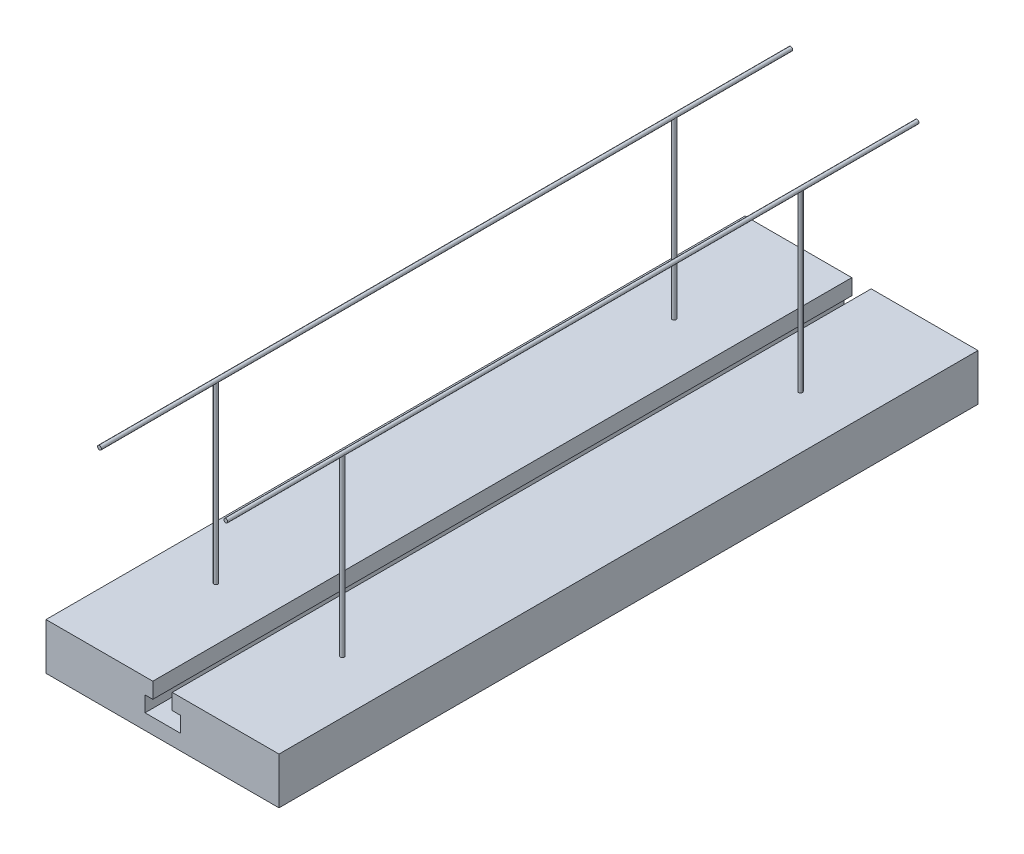
ISO-10303-21;
HEADER;
FILE_DESCRIPTION(('STEP AP214'),'2;1');
FILE_NAME('part.step','',(''),(''),'','','');
FILE_SCHEMA(('AUTOMOTIVE_DESIGN { 1 0 10303 214 1 1 1 1 }'));
ENDSEC;
DATA;
#1=APPLICATION_CONTEXT('core data for automotive mechanical design processes');
#2=APPLICATION_PROTOCOL_DEFINITION('international standard','automotive_design',2000,#1);
#3=PRODUCT_CONTEXT('',#1,'mechanical');
#4=PRODUCT('Part','Part','',(#3));
#5=PRODUCT_RELATED_PRODUCT_CATEGORY('part','',(#4));
#6=PRODUCT_DEFINITION_FORMATION('','',#4);
#7=PRODUCT_DEFINITION_CONTEXT('part definition',#1,'design');
#8=PRODUCT_DEFINITION('design','',#6,#7);
#9=PRODUCT_DEFINITION_SHAPE('','',#8);
#10=(LENGTH_UNIT() NAMED_UNIT(*) SI_UNIT(.MILLI.,.METRE.));
#11=(NAMED_UNIT(*) PLANE_ANGLE_UNIT() SI_UNIT($,.RADIAN.));
#12=(NAMED_UNIT(*) SI_UNIT($,.STERADIAN.) SOLID_ANGLE_UNIT());
#13=UNCERTAINTY_MEASURE_WITH_UNIT(LENGTH_MEASURE(1.E-05),#10,'distance_accuracy_value','');
#14=(GEOMETRIC_REPRESENTATION_CONTEXT(3) GLOBAL_UNCERTAINTY_ASSIGNED_CONTEXT((#13)) GLOBAL_UNIT_ASSIGNED_CONTEXT((#10,
#11,#12)) REPRESENTATION_CONTEXT('',''));
#15=CARTESIAN_POINT('',(0.,0.,0.));
#16=DIRECTION('',(0.,0.,1.));
#17=DIRECTION('',(1.,0.,0.));
#18=AXIS2_PLACEMENT_3D('',#15,#16,#17);
#19=CARTESIAN_POINT('',(255.136171472381,37.5771918985887,2700.));
#20=DIRECTION('',(0.,1.,0.));
#21=DIRECTION('',(0.,0.,1.));
#22=AXIS2_PLACEMENT_3D('',#19,#20,#21);
#23=PLANE('',#22);
#24=DIRECTION('',(1.,0.,0.));
#25=VECTOR('',#24,1.);
#26=CARTESIAN_POINT('',(255.136171472381,37.5771918985887,900.000000000005));
#27=LINE('',#26,#25);
#28=CARTESIAN_POINT('',(40.1509964356934,37.5771918985887,900.000000000005));
#29=VERTEX_POINT('',#28);
#30=CARTESIAN_POINT('',(315.159081533357,37.5771918985887,900.000000000005));
#31=VERTEX_POINT('',#30);
#32=EDGE_CURVE('P0_E133',#29,#31,#27,.T.);
#33=ORIENTED_EDGE('',*,*,#32,.F.);
#34=DIRECTION('',(0.,0.,-1.));
#35=VECTOR('',#34,1.);
#36=CARTESIAN_POINT('',(40.1509964356934,37.5771918985887,2700.));
#37=LINE('',#36,#35);
#38=CARTESIAN_POINT('',(40.1509964356934,37.5771918985887,2700.));
#39=VERTEX_POINT('',#38);
#40=EDGE_CURVE('P0_E22',#39,#29,#37,.T.);
#41=ORIENTED_EDGE('',*,*,#40,.F.);
#42=DIRECTION('',(1.,0.,0.));
#43=VECTOR('',#42,1.);
#44=CARTESIAN_POINT('',(255.136171472381,37.5771918985887,2700.));
#45=LINE('',#44,#43);
#46=CARTESIAN_POINT('',(315.159081533357,37.5771918985887,2700.));
#47=VERTEX_POINT('',#46);
#48=EDGE_CURVE('P0_E159',#39,#47,#45,.T.);
#49=ORIENTED_EDGE('',*,*,#48,.T.);
#50=DIRECTION('',(0.,0.,-1.));
#51=VECTOR('',#50,1.);
#52=CARTESIAN_POINT('',(315.159081533357,37.5771918985887,2700.));
#53=LINE('',#52,#51);
#54=EDGE_CURVE('P0_E37',#47,#31,#53,.T.);
#55=ORIENTED_EDGE('',*,*,#54,.T.);
#56=EDGE_LOOP('',(#33,#41,#49,#55));
#57=FACE_BOUND('',#56,.T.);
#58=ADVANCED_FACE('P0_F15',(#57),#23,.T.);
#59=CARTESIAN_POINT('',(40.1509964356934,222.904551654686,2700.));
#60=DIRECTION('',(1.,0.,0.));
#61=DIRECTION('',(0.,0.,-1.));
#62=AXIS2_PLACEMENT_3D('',#59,#60,#61);
#63=PLANE('',#62);
#64=DIRECTION('',(0.,-1.,0.));
#65=VECTOR('',#64,1.);
#66=CARTESIAN_POINT('',(40.1509964356934,222.904551654686,900.000000000005));
#67=LINE('',#66,#65);
#68=CARTESIAN_POINT('',(40.1509964356934,-2.92836654211198,900.000000000005));
#69=VERTEX_POINT('',#68);
#70=EDGE_CURVE('P0_E135',#29,#69,#67,.T.);
#71=ORIENTED_EDGE('',*,*,#70,.T.);
#72=DIRECTION('',(0.,0.,-1.));
#73=VECTOR('',#72,1.);
#74=CARTESIAN_POINT('',(40.1509964356934,-2.92836654211198,2700.));
#75=LINE('',#74,#73);
#76=CARTESIAN_POINT('',(40.1509964356934,-2.92836654211198,2700.));
#77=VERTEX_POINT('',#76);
#78=EDGE_CURVE('P0_E171',#77,#69,#75,.T.);
#79=ORIENTED_EDGE('',*,*,#78,.F.);
#80=DIRECTION('',(0.,-1.,0.));
#81=VECTOR('',#80,1.);
#82=CARTESIAN_POINT('',(40.1509964356934,222.904551654686,2700.));
#83=LINE('',#82,#81);
#84=EDGE_CURVE('P0_E177',#39,#77,#83,.T.);
#85=ORIENTED_EDGE('',*,*,#84,.F.);
#86=ORIENTED_EDGE('',*,*,#40,.T.);
#87=EDGE_LOOP('',(#71,#79,#85,#86));
#88=FACE_BOUND('',#87,.T.);
#89=ADVANCED_FACE('P0_F175',(#88),#63,.F.);
#90=CARTESIAN_POINT('',(255.136171472381,-2.92836654211198,2700.));
#91=DIRECTION('',(0.,1.,0.));
#92=DIRECTION('',(0.,0.,1.));
#93=AXIS2_PLACEMENT_3D('',#90,#91,#92);
#94=PLANE('',#93);
#95=DIRECTION('',(1.,0.,0.));
#96=VECTOR('',#95,1.);
#97=CARTESIAN_POINT('',(255.136171472381,-2.92836654211198,900.000000000005));
#98=LINE('',#97,#96);
#99=CARTESIAN_POINT('',(61.6673890539489,-2.92836654211198,900.000000000002));
#100=VERTEX_POINT('',#99);
#101=EDGE_CURVE('P0_E138',#69,#100,#98,.T.);
#102=ORIENTED_EDGE('',*,*,#101,.T.);
#103=DIRECTION('',(0.,0.,1.));
#104=VECTOR('',#103,1.);
#105=CARTESIAN_POINT('',(61.6673890539489,-2.92836654211198,-48290.));
#106=LINE('',#105,#104);
#107=CARTESIAN_POINT('',(61.6673890539489,-2.92836654211198,2700.00000000001));
#108=VERTEX_POINT('',#107);
#109=EDGE_CURVE('P0_E236',#100,#108,#106,.T.);
#110=ORIENTED_EDGE('',*,*,#109,.T.);
#111=DIRECTION('',(1.,0.,0.));
#112=VECTOR('',#111,1.);
#113=CARTESIAN_POINT('',(255.136171472381,-2.92836654211198,2700.));
#114=LINE('',#113,#112);
#115=EDGE_CURVE('P0_E241',#77,#108,#114,.T.);
#116=ORIENTED_EDGE('',*,*,#115,.F.);
#117=ORIENTED_EDGE('',*,*,#78,.T.);
#118=EDGE_LOOP('',(#102,#110,#116,#117));
#119=FACE_BOUND('',#118,.T.);
#120=ADVANCED_FACE('P0_F186',(#119),#94,.F.);
#121=CARTESIAN_POINT('',(255.136171472381,-42.9283665421119,2700.));
#122=DIRECTION('',(0.,-1.,0.));
#123=DIRECTION('',(1.,0.,0.));
#124=AXIS2_PLACEMENT_3D('',#121,#122,#123);
#125=PLANE('',#124);
#126=DIRECTION('',(-1.,0.,0.));
#127=VECTOR('',#126,1.);
#128=CARTESIAN_POINT('',(255.136171472381,-42.9283665421119,900.000000000005));
#129=LINE('',#128,#127);
#130=CARTESIAN_POINT('',(61.6673890539489,-42.928366542112,900.000000000005));
#131=VERTEX_POINT('',#130);
#132=CARTESIAN_POINT('',(-29.8490035643066,-42.928366542112,900.000000000005));
#133=VERTEX_POINT('',#132);
#134=EDGE_CURVE('P0_E28',#131,#133,#129,.T.);
#135=ORIENTED_EDGE('',*,*,#134,.T.);
#136=DIRECTION('',(0.,0.,-1.));
#137=VECTOR('',#136,1.);
#138=CARTESIAN_POINT('',(-29.8490035643066,-42.928366542112,2700.));
#139=LINE('',#138,#137);
#140=CARTESIAN_POINT('',(-29.8490035643066,-42.928366542112,2700.));
#141=VERTEX_POINT('',#140);
#142=EDGE_CURVE('P0_E169',#141,#133,#139,.T.);
#143=ORIENTED_EDGE('',*,*,#142,.F.);
#144=DIRECTION('',(-1.,0.,0.));
#145=VECTOR('',#144,1.);
#146=CARTESIAN_POINT('',(255.136171472381,-42.9283665421119,2700.));
#147=LINE('',#146,#145);
#148=CARTESIAN_POINT('',(61.6673890539489,-42.928366542112,2700.00000000001));
#149=VERTEX_POINT('',#148);
#150=EDGE_CURVE('P0_E248',#149,#141,#147,.T.);
#151=ORIENTED_EDGE('',*,*,#150,.F.);
#152=DIRECTION('',(0.,0.,1.));
#153=VECTOR('',#152,1.);
#154=CARTESIAN_POINT('',(61.6673890539489,-42.928366542112,-48290.));
#155=LINE('',#154,#153);
#156=EDGE_CURVE('P0_E238',#131,#149,#155,.T.);
#157=ORIENTED_EDGE('',*,*,#156,.F.);
#158=EDGE_LOOP('',(#135,#143,#151,#157));
#159=FACE_BOUND('',#158,.T.);
#160=ADVANCED_FACE('P0_F190',(#159),#125,.F.);
#161=CARTESIAN_POINT('',(-29.8490035643069,222.904551654686,2700.));
#162=DIRECTION('',(1.,0.,0.));
#163=DIRECTION('',(0.,1.,0.));
#164=AXIS2_PLACEMENT_3D('',#161,#162,#163);
#165=PLANE('',#164);
#166=DIRECTION('',(0.,-1.,0.));
#167=VECTOR('',#166,1.);
#168=CARTESIAN_POINT('',(-29.8490035643069,222.904551654686,900.000000000005));
#169=LINE('',#168,#167);
#170=CARTESIAN_POINT('',(-29.8490035643066,-2.92836654211204,900.000000000005));
#171=VERTEX_POINT('',#170);
#172=EDGE_CURVE('P0_E142',#171,#133,#169,.T.);
#173=ORIENTED_EDGE('',*,*,#172,.F.);
#174=DIRECTION('',(0.,0.,-1.));
#175=VECTOR('',#174,1.);
#176=CARTESIAN_POINT('',(-29.8490035643066,-2.92836654211204,2700.));
#177=LINE('',#176,#175);
#178=CARTESIAN_POINT('',(-29.8490035643066,-2.92836654211204,2700.));
#179=VERTEX_POINT('',#178);
#180=EDGE_CURVE('P0_E167',#179,#171,#177,.T.);
#181=ORIENTED_EDGE('',*,*,#180,.F.);
#182=DIRECTION('',(0.,-1.,0.));
#183=VECTOR('',#182,1.);
#184=CARTESIAN_POINT('',(-29.8490035643069,222.904551654686,2700.));
#185=LINE('',#184,#183);
#186=EDGE_CURVE('P0_E250',#179,#141,#185,.T.);
#187=ORIENTED_EDGE('',*,*,#186,.T.);
#188=ORIENTED_EDGE('',*,*,#142,.T.);
#189=EDGE_LOOP('',(#173,#181,#187,#188));
#190=FACE_BOUND('',#189,.T.);
#191=ADVANCED_FACE('P0_F196',(#190),#165,.T.);
#192=CARTESIAN_POINT('',(255.136171472381,-2.92836654211204,2700.));
#193=DIRECTION('',(0.,-1.,0.));
#194=DIRECTION('',(0.,0.,-1.));
#195=AXIS2_PLACEMENT_3D('',#192,#193,#194);
#196=PLANE('',#195);
#197=DIRECTION('',(-1.,0.,0.));
#198=VECTOR('',#197,1.);
#199=CARTESIAN_POINT('',(255.136171472381,-2.92836654211204,900.000000000005));
#200=LINE('',#199,#198);
#201=CARTESIAN_POINT('',(-9.84900356430662,-2.92836654211204,900.000000000005));
#202=VERTEX_POINT('',#201);
#203=EDGE_CURVE('P0_E144',#202,#171,#200,.T.);
#204=ORIENTED_EDGE('',*,*,#203,.F.);
#205=DIRECTION('',(0.,0.,-1.));
#206=VECTOR('',#205,1.);
#207=CARTESIAN_POINT('',(-9.84900356430662,-2.92836654211204,2700.));
#208=LINE('',#207,#206);
#209=CARTESIAN_POINT('',(-9.84900356430662,-2.92836654211204,2700.));
#210=VERTEX_POINT('',#209);
#211=EDGE_CURVE('P0_E165',#210,#202,#208,.T.);
#212=ORIENTED_EDGE('',*,*,#211,.F.);
#213=DIRECTION('',(-1.,0.,0.));
#214=VECTOR('',#213,1.);
#215=CARTESIAN_POINT('',(255.136171472381,-2.92836654211204,2700.));
#216=LINE('',#215,#214);
#217=EDGE_CURVE('P0_E253',#210,#179,#216,.T.);
#218=ORIENTED_EDGE('',*,*,#217,.T.);
#219=ORIENTED_EDGE('',*,*,#180,.T.);
#220=EDGE_LOOP('',(#204,#212,#218,#219));
#221=FACE_BOUND('',#220,.T.);
#222=ADVANCED_FACE('P0_F200',(#221),#196,.T.);
#223=CARTESIAN_POINT('',(-9.84900356430662,222.904551654686,2700.));
#224=DIRECTION('',(1.,0.,0.));
#225=DIRECTION('',(0.,0.,-1.));
#226=AXIS2_PLACEMENT_3D('',#223,#224,#225);
#227=PLANE('',#226);
#228=DIRECTION('',(0.,-1.,0.));
#229=VECTOR('',#228,1.);
#230=CARTESIAN_POINT('',(-9.84900356430662,222.904551654686,900.000000000005));
#231=LINE('',#230,#229);
#232=CARTESIAN_POINT('',(-9.84900356430662,37.5771918985887,900.000000000005));
#233=VERTEX_POINT('',#232);
#234=EDGE_CURVE('P0_E147',#233,#202,#231,.T.);
#235=ORIENTED_EDGE('',*,*,#234,.F.);
#236=DIRECTION('',(0.,0.,-1.));
#237=VECTOR('',#236,1.);
#238=CARTESIAN_POINT('',(-9.84900356430662,37.5771918985887,2700.));
#239=LINE('',#238,#237);
#240=CARTESIAN_POINT('',(-9.84900356430662,37.5771918985887,2700.));
#241=VERTEX_POINT('',#240);
#242=EDGE_CURVE('P0_E163',#241,#233,#239,.T.);
#243=ORIENTED_EDGE('',*,*,#242,.F.);
#244=DIRECTION('',(0.,-1.,0.));
#245=VECTOR('',#244,1.);
#246=CARTESIAN_POINT('',(-9.84900356430662,222.904551654686,2700.));
#247=LINE('',#246,#245);
#248=EDGE_CURVE('P0_E256',#241,#210,#247,.T.);
#249=ORIENTED_EDGE('',*,*,#248,.T.);
#250=ORIENTED_EDGE('',*,*,#211,.T.);
#251=EDGE_LOOP('',(#235,#243,#249,#250));
#252=FACE_BOUND('',#251,.T.);
#253=ADVANCED_FACE('P0_F204',(#252),#227,.T.);
#254=CARTESIAN_POINT('',(255.136171472381,37.5771918985887,2700.));
#255=DIRECTION('',(0.,1.,0.));
#256=DIRECTION('',(0.,0.,1.));
#257=AXIS2_PLACEMENT_3D('',#254,#255,#256);
#258=PLANE('',#257);
#259=DIRECTION('',(1.,0.,0.));
#260=VECTOR('',#259,1.);
#261=CARTESIAN_POINT('',(255.136171472381,37.5771918985887,900.000000000005));
#262=LINE('',#261,#260);
#263=CARTESIAN_POINT('',(-284.840918466643,37.5771918985887,900.000000000005));
#264=VERTEX_POINT('',#263);
#265=EDGE_CURVE('P0_E150',#264,#233,#262,.T.);
#266=ORIENTED_EDGE('',*,*,#265,.F.);
#267=DIRECTION('',(0.,0.,-1.));
#268=VECTOR('',#267,1.);
#269=CARTESIAN_POINT('',(-284.840918466643,37.5771918985887,2700.));
#270=LINE('',#269,#268);
#271=CARTESIAN_POINT('',(-284.840918466643,37.5771918985887,2700.));
#272=VERTEX_POINT('',#271);
#273=EDGE_CURVE('P0_E124',#272,#264,#270,.T.);
#274=ORIENTED_EDGE('',*,*,#273,.F.);
#275=DIRECTION('',(1.,0.,0.));
#276=VECTOR('',#275,1.);
#277=CARTESIAN_POINT('',(255.136171472381,37.5771918985887,2700.));
#278=LINE('',#277,#276);
#279=EDGE_CURVE('P0_E113',#272,#241,#278,.T.);
#280=ORIENTED_EDGE('',*,*,#279,.T.);
#281=ORIENTED_EDGE('',*,*,#242,.T.);
#282=EDGE_LOOP('',(#266,#274,#280,#281));
#283=FACE_BOUND('',#282,.T.);
#284=ADVANCED_FACE('P0_F208',(#283),#258,.T.);
#285=CARTESIAN_POINT('',(-284.840918466643,222.904551654686,2700.));
#286=DIRECTION('',(1.,0.,0.));
#287=DIRECTION('',(0.,1.,0.));
#288=AXIS2_PLACEMENT_3D('',#285,#286,#287);
#289=PLANE('',#288);
#290=DIRECTION('',(0.,-1.,0.));
#291=VECTOR('',#290,1.);
#292=CARTESIAN_POINT('',(-284.840918466643,222.904551654686,900.000000000005));
#293=LINE('',#292,#291);
#294=CARTESIAN_POINT('',(-284.840918466643,-82.4228081014112,900.000000000005));
#295=VERTEX_POINT('',#294);
#296=EDGE_CURVE('P0_E120',#264,#295,#293,.T.);
#297=ORIENTED_EDGE('',*,*,#296,.T.);
#298=DIRECTION('',(0.,0.,-1.));
#299=VECTOR('',#298,1.);
#300=CARTESIAN_POINT('',(-284.840918466643,-82.4228081014112,2700.));
#301=LINE('',#300,#299);
#302=CARTESIAN_POINT('',(-284.840918466643,-82.4228081014112,2700.));
#303=VERTEX_POINT('',#302);
#304=EDGE_CURVE('P0_E117',#303,#295,#301,.T.);
#305=ORIENTED_EDGE('',*,*,#304,.F.);
#306=DIRECTION('',(0.,-1.,0.));
#307=VECTOR('',#306,1.);
#308=CARTESIAN_POINT('',(-284.840918466643,222.904551654686,2700.));
#309=LINE('',#308,#307);
#310=EDGE_CURVE('P0_E103',#272,#303,#309,.T.);
#311=ORIENTED_EDGE('',*,*,#310,.F.);
#312=ORIENTED_EDGE('',*,*,#273,.T.);
#313=EDGE_LOOP('',(#297,#305,#311,#312));
#314=FACE_BOUND('',#313,.T.);
#315=ADVANCED_FACE('P0_F118',(#314),#289,.F.);
#316=CARTESIAN_POINT('',(255.136171472381,-82.4228081014112,2700.));
#317=DIRECTION('',(0.,1.,0.));
#318=DIRECTION('',(0.,0.,1.));
#319=AXIS2_PLACEMENT_3D('',#316,#317,#318);
#320=PLANE('',#319);
#321=DIRECTION('',(1.,0.,0.));
#322=VECTOR('',#321,1.);
#323=CARTESIAN_POINT('',(255.136171472381,-82.4228081014112,900.000000000005));
#324=LINE('',#323,#322);
#325=CARTESIAN_POINT('',(315.159081533357,-82.4228081014112,900.000000000005));
#326=VERTEX_POINT('',#325);
#327=EDGE_CURVE('P0_E154',#295,#326,#324,.T.);
#328=ORIENTED_EDGE('',*,*,#327,.T.);
#329=DIRECTION('',(0.,0.,-1.));
#330=VECTOR('',#329,1.);
#331=CARTESIAN_POINT('',(315.159081533357,-82.4228081014112,2700.));
#332=LINE('',#331,#330);
#333=CARTESIAN_POINT('',(315.159081533357,-82.4228081014112,2700.));
#334=VERTEX_POINT('',#333);
#335=EDGE_CURVE('P0_E125',#334,#326,#332,.T.);
#336=ORIENTED_EDGE('',*,*,#335,.F.);
#337=DIRECTION('',(1.,0.,0.));
#338=VECTOR('',#337,1.);
#339=CARTESIAN_POINT('',(255.136171472381,-82.4228081014112,2700.));
#340=LINE('',#339,#338);
#341=EDGE_CURVE('P0_E109',#303,#334,#340,.T.);
#342=ORIENTED_EDGE('',*,*,#341,.F.);
#343=ORIENTED_EDGE('',*,*,#304,.T.);
#344=EDGE_LOOP('',(#328,#336,#342,#343));
#345=FACE_BOUND('',#344,.T.);
#346=ADVANCED_FACE('P0_F127',(#345),#320,.F.);
#347=CARTESIAN_POINT('',(315.159081533357,222.904551654686,2700.));
#348=DIRECTION('',(1.,0.,0.));
#349=DIRECTION('',(0.,0.,-1.));
#350=AXIS2_PLACEMENT_3D('',#347,#348,#349);
#351=PLANE('',#350);
#352=DIRECTION('',(0.,-1.,0.));
#353=VECTOR('',#352,1.);
#354=CARTESIAN_POINT('',(315.159081533357,222.904551654686,900.000000000005));
#355=LINE('',#354,#353);
#356=EDGE_CURVE('P0_E156',#31,#326,#355,.T.);
#357=ORIENTED_EDGE('',*,*,#356,.F.);
#358=ORIENTED_EDGE('',*,*,#54,.F.);
#359=DIRECTION('',(0.,-1.,0.));
#360=VECTOR('',#359,1.);
#361=CARTESIAN_POINT('',(315.159081533357,222.904551654686,2700.));
#362=LINE('',#361,#360);
#363=EDGE_CURVE('P0_E128',#47,#334,#362,.T.);
#364=ORIENTED_EDGE('',*,*,#363,.T.);
#365=ORIENTED_EDGE('',*,*,#335,.T.);
#366=EDGE_LOOP('',(#357,#358,#364,#365));
#367=FACE_BOUND('',#366,.T.);
#368=ADVANCED_FACE('P0_F217',(#367),#351,.T.);
#369=CARTESIAN_POINT('',(255.136171472381,222.904551654686,2700.));
#370=DIRECTION('',(0.,0.,1.));
#371=DIRECTION('',(1.,0.,0.));
#372=AXIS2_PLACEMENT_3D('',#369,#370,#371);
#373=PLANE('',#372);
#374=ORIENTED_EDGE('',*,*,#115,.T.);
#375=DIRECTION('',(0.,1.,0.));
#376=VECTOR('',#375,1.);
#377=CARTESIAN_POINT('',(61.6673890539489,222.904551654686,2700.));
#378=LINE('',#377,#376);
#379=EDGE_CURVE('P0_E136',#149,#108,#378,.T.);
#380=ORIENTED_EDGE('',*,*,#379,.F.);
#381=ORIENTED_EDGE('',*,*,#150,.T.);
#382=ORIENTED_EDGE('',*,*,#186,.F.);
#383=ORIENTED_EDGE('',*,*,#217,.F.);
#384=ORIENTED_EDGE('',*,*,#248,.F.);
#385=ORIENTED_EDGE('',*,*,#279,.F.);
#386=ORIENTED_EDGE('',*,*,#310,.T.);
#387=ORIENTED_EDGE('',*,*,#341,.T.);
#388=ORIENTED_EDGE('',*,*,#363,.F.);
#389=ORIENTED_EDGE('',*,*,#48,.F.);
#390=ORIENTED_EDGE('',*,*,#84,.T.);
#391=EDGE_LOOP('',(#374,#380,#381,#382,#383,#384,#385,#386,#387,#388,#389,#390));
#392=FACE_BOUND('',#391,.T.);
#393=ADVANCED_FACE('P0_F106',(#392),#373,.T.);
#394=CARTESIAN_POINT('',(255.136171472381,222.904551654686,900.000000000005));
#395=DIRECTION('',(0.,0.,1.));
#396=DIRECTION('',(1.,0.,0.));
#397=AXIS2_PLACEMENT_3D('',#394,#395,#396);
#398=PLANE('',#397);
#399=DIRECTION('',(0.,1.,0.));
#400=VECTOR('',#399,1.);
#401=CARTESIAN_POINT('',(61.6673890539489,222.904551654686,900.000000000005));
#402=LINE('',#401,#400);
#403=EDGE_CURVE('P0_E10',#131,#100,#402,.T.);
#404=ORIENTED_EDGE('',*,*,#403,.T.);
#405=ORIENTED_EDGE('',*,*,#101,.F.);
#406=ORIENTED_EDGE('',*,*,#70,.F.);
#407=ORIENTED_EDGE('',*,*,#32,.T.);
#408=ORIENTED_EDGE('',*,*,#356,.T.);
#409=ORIENTED_EDGE('',*,*,#327,.F.);
#410=ORIENTED_EDGE('',*,*,#296,.F.);
#411=ORIENTED_EDGE('',*,*,#265,.T.);
#412=ORIENTED_EDGE('',*,*,#234,.T.);
#413=ORIENTED_EDGE('',*,*,#203,.T.);
#414=ORIENTED_EDGE('',*,*,#172,.T.);
#415=ORIENTED_EDGE('',*,*,#134,.F.);
#416=EDGE_LOOP('',(#404,#405,#406,#407,#408,#409,#410,#411,#412,#413,#414,#415));
#417=FACE_BOUND('',#416,.T.);
#418=ADVANCED_FACE('P0_F180',(#417),#398,.F.);
#419=CARTESIAN_POINT('',(61.6673890539489,-2.92836654211198,-48290.));
#420=DIRECTION('',(1.,0.,0.));
#421=DIRECTION('',(0.,0.,-1.));
#422=AXIS2_PLACEMENT_3D('',#419,#420,#421);
#423=PLANE('',#422);
#424=ORIENTED_EDGE('',*,*,#379,.T.);
#425=ORIENTED_EDGE('',*,*,#109,.F.);
#426=ORIENTED_EDGE('',*,*,#403,.F.);
#427=ORIENTED_EDGE('',*,*,#156,.T.);
#428=EDGE_LOOP('',(#424,#425,#426,#427));
#429=FACE_BOUND('',#428,.T.);
#430=ADVANCED_FACE('P0_F222',(#429),#423,.F.);
#431=CLOSED_SHELL('',(#58,#89,#120,#160,#191,#222,#253,#284,#315,#346,#368,#393,#418,#430));
#432=MANIFOLD_SOLID_BREP('P0_B1',#431);
#433=CARTESIAN_POINT('',(178.130204002886,489.577191898589,920.000000000004));
#434=DIRECTION('',(0.,0.,1.));
#435=DIRECTION('',(-1.,0.,0.));
#436=AXIS2_PLACEMENT_3D('',#433,#434,#435);
#437=CYLINDRICAL_SURFACE('',#436,5.);
#438=CARTESIAN_POINT('',(178.130204002886,489.577191898589,2400.));
#439=DIRECTION('',(0.,0.707106781186547,0.707106781186548));
#440=DIRECTION('',(0.,-0.707106781186547,0.707106781186548));
#441=AXIS2_PLACEMENT_3D('',#438,#439,#440);
#442=ELLIPSE('',#441,7.07106781186548,5.);
#443=CARTESIAN_POINT('',(183.130204002886,489.577191898589,2400.00000000001));
#444=VERTEX_POINT('',#443);
#445=CARTESIAN_POINT('',(173.130204002886,489.577191898589,2400.));
#446=VERTEX_POINT('',#445);
#447=EDGE_CURVE('P1_E41',#444,#446,#442,.F.);
#448=ORIENTED_EDGE('',*,*,#447,.F.);
#449=CARTESIAN_POINT('',(178.130204002886,489.577191898589,2400.));
#450=DIRECTION('',(0.,-0.707106781186547,0.707106781186548));
#451=DIRECTION('',(0.,0.707106781186547,0.707106781186548));
#452=AXIS2_PLACEMENT_3D('',#449,#450,#451);
#453=ELLIPSE('',#452,7.07106781186548,5.);
#454=EDGE_CURVE('P1_E34',#446,#444,#453,.T.);
#455=ORIENTED_EDGE('',*,*,#454,.F.);
#456=EDGE_LOOP('',(#448,#455));
#457=FACE_BOUND('',#456,.T.);
#458=CARTESIAN_POINT('',(178.130204002886,489.577191898589,920.000000000004));
#459=DIRECTION('',(0.,0.,-1.));
#460=DIRECTION('',(1.,0.,0.));
#461=AXIS2_PLACEMENT_3D('',#458,#459,#460);
#462=CIRCLE('',#461,5.);
#463=CARTESIAN_POINT('',(183.130204002886,489.577191898589,920.000000000004));
#464=VERTEX_POINT('',#463);
#465=EDGE_CURVE('P1_E45',#464,#464,#462,.T.);
#466=ORIENTED_EDGE('',*,*,#465,.F.);
#467=EDGE_LOOP('',(#466));
#468=FACE_BOUND('',#467,.T.);
#469=CARTESIAN_POINT('',(178.130204002886,489.577191898589,2700.));
#470=DIRECTION('',(0.,0.,-1.));
#471=DIRECTION('',(1.,0.,0.));
#472=AXIS2_PLACEMENT_3D('',#469,#470,#471);
#473=CIRCLE('',#472,5.);
#474=CARTESIAN_POINT('',(183.130204002886,489.577191898589,2700.));
#475=VERTEX_POINT('',#474);
#476=EDGE_CURVE('P1_E46',#475,#475,#473,.T.);
#477=ORIENTED_EDGE('',*,*,#476,.T.);
#478=EDGE_LOOP('',(#477));
#479=FACE_BOUND('',#478,.T.);
#480=CARTESIAN_POINT('',(178.130204002886,489.577191898589,1220.));
#481=DIRECTION('',(0.,0.707106781186547,0.707106781186548));
#482=DIRECTION('',(0.,-0.707106781186547,0.707106781186548));
#483=AXIS2_PLACEMENT_3D('',#480,#481,#482);
#484=ELLIPSE('',#483,7.07106781186548,5.);
#485=CARTESIAN_POINT('',(183.130204002886,489.577191898589,1220.));
#486=VERTEX_POINT('',#485);
#487=CARTESIAN_POINT('',(173.130204002886,489.577191898589,1220.));
#488=VERTEX_POINT('',#487);
#489=EDGE_CURVE('P1_E11',#486,#488,#484,.F.);
#490=ORIENTED_EDGE('',*,*,#489,.F.);
#491=CARTESIAN_POINT('',(178.130204002886,489.577191898589,1220.));
#492=DIRECTION('',(0.,-0.707106781186547,0.707106781186548));
#493=DIRECTION('',(0.,0.707106781186547,0.707106781186548));
#494=AXIS2_PLACEMENT_3D('',#491,#492,#493);
#495=ELLIPSE('',#494,7.07106781186548,5.);
#496=EDGE_CURVE('P1_E23',#488,#486,#495,.T.);
#497=ORIENTED_EDGE('',*,*,#496,.F.);
#498=EDGE_LOOP('',(#490,#497));
#499=FACE_BOUND('',#498,.T.);
#500=ADVANCED_FACE('P1_F16',(#457,#468,#479,#499),#437,.T.);
#501=CARTESIAN_POINT('',(178.130204002886,489.577191898589,920.000000000004));
#502=DIRECTION('',(0.,0.,-1.));
#503=DIRECTION('',(1.,0.,0.));
#504=AXIS2_PLACEMENT_3D('',#501,#502,#503);
#505=PLANE('',#504);
#506=ORIENTED_EDGE('',*,*,#465,.T.);
#507=EDGE_LOOP('',(#506));
#508=FACE_BOUND('',#507,.T.);
#509=ADVANCED_FACE('P1_F73',(#508),#505,.T.);
#510=CARTESIAN_POINT('',(178.130204002886,489.577191898589,2700.));
#511=DIRECTION('',(0.,0.,-1.));
#512=DIRECTION('',(1.,0.,0.));
#513=AXIS2_PLACEMENT_3D('',#510,#511,#512);
#514=PLANE('',#513);
#515=ORIENTED_EDGE('',*,*,#476,.F.);
#516=EDGE_LOOP('',(#515));
#517=FACE_BOUND('',#516,.T.);
#518=ADVANCED_FACE('P1_F77',(#517),#514,.F.);
#519=CARTESIAN_POINT('',(178.130204002886,37.5771918985887,2400.00000000001));
#520=DIRECTION('',(0.,1.,0.));
#521=DIRECTION('',(0.,0.,1.));
#522=AXIS2_PLACEMENT_3D('',#519,#520,#521);
#523=CYLINDRICAL_SURFACE('',#522,5.);
#524=CARTESIAN_POINT('',(178.130204002886,37.5771918985887,2400.00000000001));
#525=DIRECTION('',(0.,-1.,0.));
#526=DIRECTION('',(0.,0.,-1.));
#527=AXIS2_PLACEMENT_3D('',#524,#525,#526);
#528=CIRCLE('',#527,5.);
#529=CARTESIAN_POINT('',(178.130204002886,37.5771918985887,2395.00000000001));
#530=VERTEX_POINT('',#529);
#531=EDGE_CURVE('P1_E49',#530,#530,#528,.T.);
#532=ORIENTED_EDGE('',*,*,#531,.F.);
#533=EDGE_LOOP('',(#532));
#534=FACE_BOUND('',#533,.T.);
#535=ORIENTED_EDGE('',*,*,#454,.T.);
#536=ORIENTED_EDGE('',*,*,#447,.T.);
#537=EDGE_LOOP('',(#535,#536));
#538=FACE_BOUND('',#537,.T.);
#539=ADVANCED_FACE('P1_F69',(#534,#538),#523,.T.);
#540=CARTESIAN_POINT('',(178.130204002886,37.5771918985887,2400.00000000001));
#541=DIRECTION('',(0.,-1.,0.));
#542=DIRECTION('',(0.,0.,-1.));
#543=AXIS2_PLACEMENT_3D('',#540,#541,#542);
#544=PLANE('',#543);
#545=ORIENTED_EDGE('',*,*,#531,.T.);
#546=EDGE_LOOP('',(#545));
#547=FACE_BOUND('',#546,.T.);
#548=ADVANCED_FACE('P1_F61',(#547),#544,.T.);
#549=CARTESIAN_POINT('',(178.130204002886,37.5771918985887,1220.));
#550=DIRECTION('',(0.,1.,0.));
#551=DIRECTION('',(0.,0.,1.));
#552=AXIS2_PLACEMENT_3D('',#549,#550,#551);
#553=CYLINDRICAL_SURFACE('',#552,5.);
#554=CARTESIAN_POINT('',(178.130204002886,37.5771918985887,1220.));
#555=DIRECTION('',(0.,-1.,0.));
#556=DIRECTION('',(0.,0.,-1.));
#557=AXIS2_PLACEMENT_3D('',#554,#555,#556);
#558=CIRCLE('',#557,5.);
#559=CARTESIAN_POINT('',(178.130204002886,37.5771918985887,1215.));
#560=VERTEX_POINT('',#559);
#561=EDGE_CURVE('P1_E54',#560,#560,#558,.T.);
#562=ORIENTED_EDGE('',*,*,#561,.F.);
#563=EDGE_LOOP('',(#562));
#564=FACE_BOUND('',#563,.T.);
#565=ORIENTED_EDGE('',*,*,#496,.T.);
#566=ORIENTED_EDGE('',*,*,#489,.T.);
#567=EDGE_LOOP('',(#565,#566));
#568=FACE_BOUND('',#567,.T.);
#569=ADVANCED_FACE('P1_F40',(#564,#568),#553,.T.);
#570=CARTESIAN_POINT('',(178.130204002886,37.5771918985887,1220.));
#571=DIRECTION('',(0.,-1.,0.));
#572=DIRECTION('',(0.,0.,-1.));
#573=AXIS2_PLACEMENT_3D('',#570,#571,#572);
#574=PLANE('',#573);
#575=ORIENTED_EDGE('',*,*,#561,.T.);
#576=EDGE_LOOP('',(#575));
#577=FACE_BOUND('',#576,.T.);
#578=ADVANCED_FACE('P1_F58',(#577),#574,.T.);
#579=CLOSED_SHELL('',(#500,#509,#518,#539,#548,#569,#578));
#580=MANIFOLD_SOLID_BREP('P1_B1',#579);
#581=CARTESIAN_POINT('',(-147.12314720021,489.577191898589,920.000000000004));
#582=DIRECTION('',(0.,0.,1.));
#583=DIRECTION('',(-1.,0.,0.));
#584=AXIS2_PLACEMENT_3D('',#581,#582,#583);
#585=CYLINDRICAL_SURFACE('',#584,5.);
#586=CARTESIAN_POINT('',(-147.12314720021,489.577191898589,2400.));
#587=DIRECTION('',(0.,0.707106781186547,0.707106781186547));
#588=DIRECTION('',(0.,-0.707106781186547,0.707106781186547));
#589=AXIS2_PLACEMENT_3D('',#586,#587,#588);
#590=ELLIPSE('',#589,7.07106781186548,5.);
#591=CARTESIAN_POINT('',(-142.12314720021,489.577191898589,2400.));
#592=VERTEX_POINT('',#591);
#593=CARTESIAN_POINT('',(-152.12314720021,489.577191898589,2400.));
#594=VERTEX_POINT('',#593);
#595=EDGE_CURVE('P2_E41',#592,#594,#590,.F.);
#596=ORIENTED_EDGE('',*,*,#595,.F.);
#597=CARTESIAN_POINT('',(-147.12314720021,489.577191898589,2400.));
#598=DIRECTION('',(0.,-0.707106781186547,0.707106781186547));
#599=DIRECTION('',(0.,0.707106781186547,0.707106781186547));
#600=AXIS2_PLACEMENT_3D('',#597,#598,#599);
#601=ELLIPSE('',#600,7.07106781186548,5.);
#602=EDGE_CURVE('P2_E34',#594,#592,#601,.T.);
#603=ORIENTED_EDGE('',*,*,#602,.F.);
#604=EDGE_LOOP('',(#596,#603));
#605=FACE_BOUND('',#604,.T.);
#606=CARTESIAN_POINT('',(-147.12314720021,489.577191898589,920.000000000004));
#607=DIRECTION('',(0.,0.,-1.));
#608=DIRECTION('',(1.,0.,0.));
#609=AXIS2_PLACEMENT_3D('',#606,#607,#608);
#610=CIRCLE('',#609,5.);
#611=CARTESIAN_POINT('',(-142.12314720021,489.577191898589,920.000000000004));
#612=VERTEX_POINT('',#611);
#613=EDGE_CURVE('P2_E45',#612,#612,#610,.T.);
#614=ORIENTED_EDGE('',*,*,#613,.F.);
#615=EDGE_LOOP('',(#614));
#616=FACE_BOUND('',#615,.T.);
#617=CARTESIAN_POINT('',(-147.12314720021,489.577191898589,2700.));
#618=DIRECTION('',(0.,0.,-1.));
#619=DIRECTION('',(1.,0.,0.));
#620=AXIS2_PLACEMENT_3D('',#617,#618,#619);
#621=CIRCLE('',#620,5.);
#622=CARTESIAN_POINT('',(-142.12314720021,489.577191898589,2700.));
#623=VERTEX_POINT('',#622);
#624=EDGE_CURVE('P2_E46',#623,#623,#621,.T.);
#625=ORIENTED_EDGE('',*,*,#624,.T.);
#626=EDGE_LOOP('',(#625));
#627=FACE_BOUND('',#626,.T.);
#628=CARTESIAN_POINT('',(-147.12314720021,489.577191898589,1220.));
#629=DIRECTION('',(0.,0.707106781186547,0.707106781186547));
#630=DIRECTION('',(0.,-0.707106781186547,0.707106781186547));
#631=AXIS2_PLACEMENT_3D('',#628,#629,#630);
#632=ELLIPSE('',#631,7.07106781186548,5.);
#633=CARTESIAN_POINT('',(-142.12314720021,489.577191898589,1220.));
#634=VERTEX_POINT('',#633);
#635=CARTESIAN_POINT('',(-152.12314720021,489.577191898589,1220.));
#636=VERTEX_POINT('',#635);
#637=EDGE_CURVE('P2_E11',#634,#636,#632,.F.);
#638=ORIENTED_EDGE('',*,*,#637,.F.);
#639=CARTESIAN_POINT('',(-147.12314720021,489.577191898589,1220.));
#640=DIRECTION('',(0.,-0.707106781186547,0.707106781186547));
#641=DIRECTION('',(0.,0.707106781186547,0.707106781186547));
#642=AXIS2_PLACEMENT_3D('',#639,#640,#641);
#643=ELLIPSE('',#642,7.07106781186548,5.);
#644=EDGE_CURVE('P2_E23',#636,#634,#643,.T.);
#645=ORIENTED_EDGE('',*,*,#644,.F.);
#646=EDGE_LOOP('',(#638,#645));
#647=FACE_BOUND('',#646,.T.);
#648=ADVANCED_FACE('P2_F16',(#605,#616,#627,#647),#585,.T.);
#649=CARTESIAN_POINT('',(-147.12314720021,489.577191898589,920.000000000004));
#650=DIRECTION('',(0.,0.,-1.));
#651=DIRECTION('',(1.,0.,0.));
#652=AXIS2_PLACEMENT_3D('',#649,#650,#651);
#653=PLANE('',#652);
#654=ORIENTED_EDGE('',*,*,#613,.T.);
#655=EDGE_LOOP('',(#654));
#656=FACE_BOUND('',#655,.T.);
#657=ADVANCED_FACE('P2_F73',(#656),#653,.T.);
#658=CARTESIAN_POINT('',(-147.12314720021,489.577191898589,2700.));
#659=DIRECTION('',(0.,0.,-1.));
#660=DIRECTION('',(1.,0.,0.));
#661=AXIS2_PLACEMENT_3D('',#658,#659,#660);
#662=PLANE('',#661);
#663=ORIENTED_EDGE('',*,*,#624,.F.);
#664=EDGE_LOOP('',(#663));
#665=FACE_BOUND('',#664,.T.);
#666=ADVANCED_FACE('P2_F77',(#665),#662,.F.);
#667=CARTESIAN_POINT('',(-147.12314720021,37.5771918985887,2400.));
#668=DIRECTION('',(0.,1.,0.));
#669=DIRECTION('',(0.,0.,1.));
#670=AXIS2_PLACEMENT_3D('',#667,#668,#669);
#671=CYLINDRICAL_SURFACE('',#670,5.);
#672=CARTESIAN_POINT('',(-147.12314720021,37.5771918985887,2400.));
#673=DIRECTION('',(0.,-1.,0.));
#674=DIRECTION('',(0.,0.,-1.));
#675=AXIS2_PLACEMENT_3D('',#672,#673,#674);
#676=CIRCLE('',#675,5.);
#677=CARTESIAN_POINT('',(-147.12314720021,37.5771918985887,2395.));
#678=VERTEX_POINT('',#677);
#679=EDGE_CURVE('P2_E49',#678,#678,#676,.T.);
#680=ORIENTED_EDGE('',*,*,#679,.F.);
#681=EDGE_LOOP('',(#680));
#682=FACE_BOUND('',#681,.T.);
#683=ORIENTED_EDGE('',*,*,#602,.T.);
#684=ORIENTED_EDGE('',*,*,#595,.T.);
#685=EDGE_LOOP('',(#683,#684));
#686=FACE_BOUND('',#685,.T.);
#687=ADVANCED_FACE('P2_F69',(#682,#686),#671,.T.);
#688=CARTESIAN_POINT('',(-147.12314720021,37.5771918985887,2400.));
#689=DIRECTION('',(0.,-1.,0.));
#690=DIRECTION('',(0.,0.,-1.));
#691=AXIS2_PLACEMENT_3D('',#688,#689,#690);
#692=PLANE('',#691);
#693=ORIENTED_EDGE('',*,*,#679,.T.);
#694=EDGE_LOOP('',(#693));
#695=FACE_BOUND('',#694,.T.);
#696=ADVANCED_FACE('P2_F61',(#695),#692,.T.);
#697=CARTESIAN_POINT('',(-147.12314720021,37.5771918985887,1220.));
#698=DIRECTION('',(0.,1.,0.));
#699=DIRECTION('',(0.,0.,1.));
#700=AXIS2_PLACEMENT_3D('',#697,#698,#699);
#701=CYLINDRICAL_SURFACE('',#700,5.);
#702=CARTESIAN_POINT('',(-147.12314720021,37.5771918985887,1220.));
#703=DIRECTION('',(0.,-1.,0.));
#704=DIRECTION('',(0.,0.,-1.));
#705=AXIS2_PLACEMENT_3D('',#702,#703,#704);
#706=CIRCLE('',#705,5.);
#707=CARTESIAN_POINT('',(-147.12314720021,37.5771918985887,1215.));
#708=VERTEX_POINT('',#707);
#709=EDGE_CURVE('P2_E54',#708,#708,#706,.T.);
#710=ORIENTED_EDGE('',*,*,#709,.F.);
#711=EDGE_LOOP('',(#710));
#712=FACE_BOUND('',#711,.T.);
#713=ORIENTED_EDGE('',*,*,#644,.T.);
#714=ORIENTED_EDGE('',*,*,#637,.T.);
#715=EDGE_LOOP('',(#713,#714));
#716=FACE_BOUND('',#715,.T.);
#717=ADVANCED_FACE('P2_F40',(#712,#716),#701,.T.);
#718=CARTESIAN_POINT('',(-147.12314720021,37.5771918985887,1220.));
#719=DIRECTION('',(0.,-1.,0.));
#720=DIRECTION('',(0.,0.,-1.));
#721=AXIS2_PLACEMENT_3D('',#718,#719,#720);
#722=PLANE('',#721);
#723=ORIENTED_EDGE('',*,*,#709,.T.);
#724=EDGE_LOOP('',(#723));
#725=FACE_BOUND('',#724,.T.);
#726=ADVANCED_FACE('P2_F58',(#725),#722,.T.);
#727=CLOSED_SHELL('',(#648,#657,#666,#687,#696,#717,#726));
#728=MANIFOLD_SOLID_BREP('P2_B1',#727);
#729=ADVANCED_BREP_SHAPE_REPRESENTATION('',(#18,#432,#580,#728),#14);
#730=SHAPE_DEFINITION_REPRESENTATION(#9,#729);
ENDSEC;
END-ISO-10303-21;
